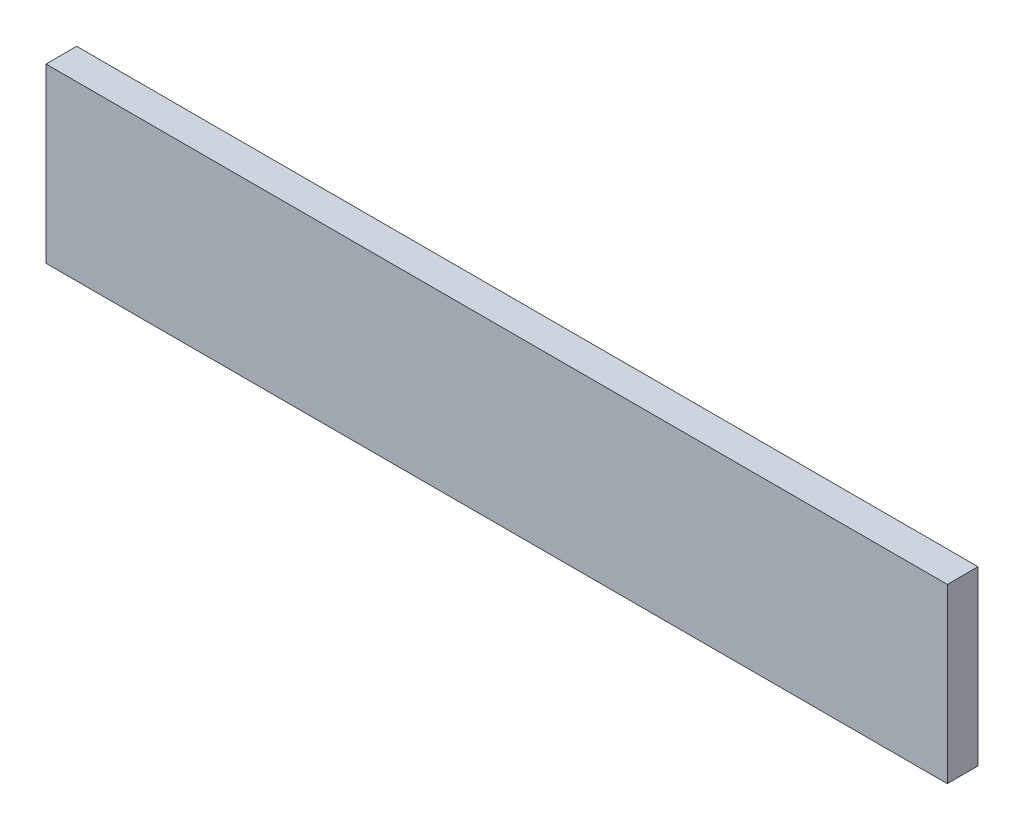
ISO-10303-21;
HEADER;
FILE_DESCRIPTION(('STEP AP214'),'2;1');
FILE_NAME('part.step','',(''),(''),'','','');
FILE_SCHEMA(('AUTOMOTIVE_DESIGN { 1 0 10303 214 1 1 1 1 }'));
ENDSEC;
DATA;
#1=APPLICATION_CONTEXT('core data for automotive mechanical design processes');
#2=APPLICATION_PROTOCOL_DEFINITION('international standard','automotive_design',2000,#1);
#3=PRODUCT_CONTEXT('',#1,'mechanical');
#4=PRODUCT('Part','Part','',(#3));
#5=PRODUCT_RELATED_PRODUCT_CATEGORY('part','',(#4));
#6=PRODUCT_DEFINITION_FORMATION('','',#4);
#7=PRODUCT_DEFINITION_CONTEXT('part definition',#1,'design');
#8=PRODUCT_DEFINITION('design','',#6,#7);
#9=PRODUCT_DEFINITION_SHAPE('','',#8);
#10=(LENGTH_UNIT() NAMED_UNIT(*) SI_UNIT(.MILLI.,.METRE.));
#11=(NAMED_UNIT(*) PLANE_ANGLE_UNIT() SI_UNIT($,.RADIAN.));
#12=(NAMED_UNIT(*) SI_UNIT($,.STERADIAN.) SOLID_ANGLE_UNIT());
#13=UNCERTAINTY_MEASURE_WITH_UNIT(LENGTH_MEASURE(1.E-05),#10,'distance_accuracy_value','');
#14=(GEOMETRIC_REPRESENTATION_CONTEXT(3) GLOBAL_UNCERTAINTY_ASSIGNED_CONTEXT((#13)) GLOBAL_UNIT_ASSIGNED_CONTEXT((#10,
#11,#12)) REPRESENTATION_CONTEXT('',''));
#15=CARTESIAN_POINT('',(0.,0.,0.));
#16=DIRECTION('',(0.,0.,1.));
#17=DIRECTION('',(1.,0.,0.));
#18=AXIS2_PLACEMENT_3D('',#15,#16,#17);
#19=CARTESIAN_POINT('',(-115.142140468227,41.2895474277367,8.));
#20=DIRECTION('',(1.,0.,0.));
#21=DIRECTION('',(0.,1.,0.));
#22=AXIS2_PLACEMENT_3D('',#19,#20,#21);
#23=PLANE('',#22);
#24=DIRECTION('',(0.,-1.,0.));
#25=VECTOR('',#24,1.);
#26=CARTESIAN_POINT('',(-115.142140468227,41.2895474277367,0.));
#27=LINE('',#26,#25);
#28=CARTESIAN_POINT('',(-115.142140468227,41.2895474277367,0.));
#29=VERTEX_POINT('',#28);
#30=CARTESIAN_POINT('',(-115.142140468227,-3.71045257226329,0.));
#31=VERTEX_POINT('',#30);
#32=EDGE_CURVE('E106',#29,#31,#27,.T.);
#33=ORIENTED_EDGE('',*,*,#32,.T.);
#34=DIRECTION('',(0.,0.,-1.));
#35=VECTOR('',#34,1.);
#36=CARTESIAN_POINT('',(-115.142140468227,-3.71045257226329,8.));
#37=LINE('',#36,#35);
#38=CARTESIAN_POINT('',(-115.142140468227,-3.71045257226329,8.));
#39=VERTEX_POINT('',#38);
#40=EDGE_CURVE('E11',#39,#31,#37,.T.);
#41=ORIENTED_EDGE('',*,*,#40,.F.);
#42=DIRECTION('',(0.,-1.,0.));
#43=VECTOR('',#42,1.);
#44=CARTESIAN_POINT('',(-115.142140468227,41.2895474277367,8.));
#45=LINE('',#44,#43);
#46=CARTESIAN_POINT('',(-115.142140468227,41.2895474277367,8.));
#47=VERTEX_POINT('',#46);
#48=EDGE_CURVE('E94',#47,#39,#45,.T.);
#49=ORIENTED_EDGE('',*,*,#48,.F.);
#50=DIRECTION('',(0.,0.,-1.));
#51=VECTOR('',#50,1.);
#52=CARTESIAN_POINT('',(-115.142140468227,41.2895474277367,8.));
#53=LINE('',#52,#51);
#54=EDGE_CURVE('E102',#47,#29,#53,.T.);
#55=ORIENTED_EDGE('',*,*,#54,.T.);
#56=EDGE_LOOP('',(#33,#41,#49,#55));
#57=FACE_BOUND('',#56,.T.);
#58=ADVANCED_FACE('F43',(#57),#23,.F.);
#59=CARTESIAN_POINT('',(-115.142140468227,-3.71045257226329,8.));
#60=DIRECTION('',(0.,1.,0.));
#61=DIRECTION('',(0.,0.,1.));
#62=AXIS2_PLACEMENT_3D('',#59,#60,#61);
#63=PLANE('',#62);
#64=DIRECTION('',(1.,0.,0.));
#65=VECTOR('',#64,1.);
#66=CARTESIAN_POINT('',(-115.142140468227,-3.71045257226329,0.));
#67=LINE('',#66,#65);
#68=CARTESIAN_POINT('',(119.857859531773,-3.71045257226329,0.));
#69=VERTEX_POINT('',#68);
#70=EDGE_CURVE('E98',#31,#69,#67,.T.);
#71=ORIENTED_EDGE('',*,*,#70,.T.);
#72=DIRECTION('',(0.,0.,-1.));
#73=VECTOR('',#72,1.);
#74=CARTESIAN_POINT('',(119.857859531773,-3.71045257226329,8.));
#75=LINE('',#74,#73);
#76=CARTESIAN_POINT('',(119.857859531773,-3.71045257226329,8.));
#77=VERTEX_POINT('',#76);
#78=EDGE_CURVE('E51',#77,#69,#75,.T.);
#79=ORIENTED_EDGE('',*,*,#78,.F.);
#80=DIRECTION('',(1.,0.,0.));
#81=VECTOR('',#80,1.);
#82=CARTESIAN_POINT('',(-115.142140468227,-3.71045257226329,8.));
#83=LINE('',#82,#81);
#84=EDGE_CURVE('E89',#39,#77,#83,.T.);
#85=ORIENTED_EDGE('',*,*,#84,.F.);
#86=ORIENTED_EDGE('',*,*,#40,.T.);
#87=EDGE_LOOP('',(#71,#79,#85,#86));
#88=FACE_BOUND('',#87,.T.);
#89=ADVANCED_FACE('F97',(#88),#63,.F.);
#90=CARTESIAN_POINT('',(119.857859531773,41.2895474277367,8.));
#91=DIRECTION('',(-1.,0.,0.));
#92=DIRECTION('',(0.,0.,1.));
#93=AXIS2_PLACEMENT_3D('',#90,#91,#92);
#94=PLANE('',#93);
#95=DIRECTION('',(0.,1.,0.));
#96=VECTOR('',#95,1.);
#97=CARTESIAN_POINT('',(119.857859531773,41.2895474277367,0.));
#98=LINE('',#97,#96);
#99=CARTESIAN_POINT('',(119.857859531773,41.2895474277367,0.));
#100=VERTEX_POINT('',#99);
#101=EDGE_CURVE('E76',#69,#100,#98,.T.);
#102=ORIENTED_EDGE('',*,*,#101,.T.);
#103=DIRECTION('',(0.,0.,-1.));
#104=VECTOR('',#103,1.);
#105=CARTESIAN_POINT('',(119.857859531773,41.2895474277367,8.));
#106=LINE('',#105,#104);
#107=CARTESIAN_POINT('',(119.857859531773,41.2895474277367,8.));
#108=VERTEX_POINT('',#107);
#109=EDGE_CURVE('E99',#108,#100,#106,.T.);
#110=ORIENTED_EDGE('',*,*,#109,.F.);
#111=DIRECTION('',(0.,1.,0.));
#112=VECTOR('',#111,1.);
#113=CARTESIAN_POINT('',(119.857859531773,41.2895474277367,8.));
#114=LINE('',#113,#112);
#115=EDGE_CURVE('E92',#77,#108,#114,.T.);
#116=ORIENTED_EDGE('',*,*,#115,.F.);
#117=ORIENTED_EDGE('',*,*,#78,.T.);
#118=EDGE_LOOP('',(#102,#110,#116,#117));
#119=FACE_BOUND('',#118,.T.);
#120=ADVANCED_FACE('F100',(#119),#94,.F.);
#121=CARTESIAN_POINT('',(-115.142140468227,41.2895474277367,8.));
#122=DIRECTION('',(0.,-1.,0.));
#123=DIRECTION('',(0.,0.,-1.));
#124=AXIS2_PLACEMENT_3D('',#121,#122,#123);
#125=PLANE('',#124);
#126=DIRECTION('',(-1.,0.,0.));
#127=VECTOR('',#126,1.);
#128=CARTESIAN_POINT('',(-115.142140468227,41.2895474277367,0.));
#129=LINE('',#128,#127);
#130=EDGE_CURVE('E82',#100,#29,#129,.T.);
#131=ORIENTED_EDGE('',*,*,#130,.T.);
#132=ORIENTED_EDGE('',*,*,#54,.F.);
#133=DIRECTION('',(-1.,0.,0.));
#134=VECTOR('',#133,1.);
#135=CARTESIAN_POINT('',(-115.142140468227,41.2895474277367,8.));
#136=LINE('',#135,#134);
#137=EDGE_CURVE('E59',#108,#47,#136,.T.);
#138=ORIENTED_EDGE('',*,*,#137,.F.);
#139=ORIENTED_EDGE('',*,*,#109,.T.);
#140=EDGE_LOOP('',(#131,#132,#138,#139));
#141=FACE_BOUND('',#140,.T.);
#142=ADVANCED_FACE('F113',(#141),#125,.F.);
#143=CARTESIAN_POINT('',(0.,0.,8.));
#144=DIRECTION('',(0.,0.,1.));
#145=DIRECTION('',(1.,0.,0.));
#146=AXIS2_PLACEMENT_3D('',#143,#144,#145);
#147=PLANE('',#146);
#148=ORIENTED_EDGE('',*,*,#48,.T.);
#149=ORIENTED_EDGE('',*,*,#84,.T.);
#150=ORIENTED_EDGE('',*,*,#115,.T.);
#151=ORIENTED_EDGE('',*,*,#137,.T.);
#152=EDGE_LOOP('',(#148,#149,#150,#151));
#153=FACE_BOUND('',#152,.T.);
#154=ADVANCED_FACE('F90',(#153),#147,.T.);
#155=CARTESIAN_POINT('',(0.,0.,0.));
#156=DIRECTION('',(0.,0.,1.));
#157=DIRECTION('',(1.,0.,0.));
#158=AXIS2_PLACEMENT_3D('',#155,#156,#157);
#159=PLANE('',#158);
#160=ORIENTED_EDGE('',*,*,#32,.F.);
#161=ORIENTED_EDGE('',*,*,#130,.F.);
#162=ORIENTED_EDGE('',*,*,#101,.F.);
#163=ORIENTED_EDGE('',*,*,#70,.F.);
#164=EDGE_LOOP('',(#160,#161,#162,#163));
#165=FACE_BOUND('',#164,.T.);
#166=ADVANCED_FACE('F116',(#165),#159,.F.);
#167=CLOSED_SHELL('',(#58,#89,#120,#142,#154,#166));
#168=MANIFOLD_SOLID_BREP('B2',#167);
#169=ADVANCED_BREP_SHAPE_REPRESENTATION('',(#18,#168),#14);
#170=SHAPE_DEFINITION_REPRESENTATION(#9,#169);
ENDSEC;
END-ISO-10303-21;
